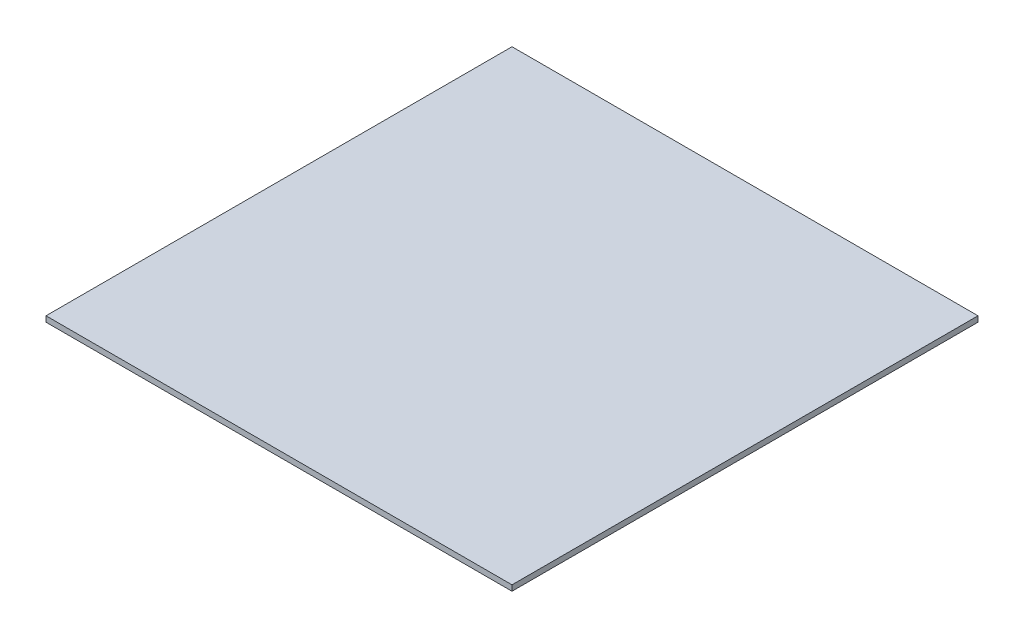
ISO-10303-21;
HEADER;
FILE_DESCRIPTION(('STEP AP214'),'2;1');
FILE_NAME('part.step','',(''),(''),'','','');
FILE_SCHEMA(('AUTOMOTIVE_DESIGN { 1 0 10303 214 1 1 1 1 }'));
ENDSEC;
DATA;
#1=APPLICATION_CONTEXT('core data for automotive mechanical design processes');
#2=APPLICATION_PROTOCOL_DEFINITION('international standard','automotive_design',2000,#1);
#3=PRODUCT_CONTEXT('',#1,'mechanical');
#4=PRODUCT('Part','Part','',(#3));
#5=PRODUCT_RELATED_PRODUCT_CATEGORY('part','',(#4));
#6=PRODUCT_DEFINITION_FORMATION('','',#4);
#7=PRODUCT_DEFINITION_CONTEXT('part definition',#1,'design');
#8=PRODUCT_DEFINITION('design','',#6,#7);
#9=PRODUCT_DEFINITION_SHAPE('','',#8);
#10=(LENGTH_UNIT() NAMED_UNIT(*) SI_UNIT(.MILLI.,.METRE.));
#11=(NAMED_UNIT(*) PLANE_ANGLE_UNIT() SI_UNIT($,.RADIAN.));
#12=(NAMED_UNIT(*) SI_UNIT($,.STERADIAN.) SOLID_ANGLE_UNIT());
#13=UNCERTAINTY_MEASURE_WITH_UNIT(LENGTH_MEASURE(1.E-05),#10,'distance_accuracy_value','');
#14=(GEOMETRIC_REPRESENTATION_CONTEXT(3) GLOBAL_UNCERTAINTY_ASSIGNED_CONTEXT((#13)) GLOBAL_UNIT_ASSIGNED_CONTEXT((#10,
#11,#12)) REPRESENTATION_CONTEXT('',''));
#15=CARTESIAN_POINT('',(0.,0.,0.));
#16=DIRECTION('',(0.,0.,1.));
#17=DIRECTION('',(1.,0.,0.));
#18=AXIS2_PLACEMENT_3D('',#15,#16,#17);
#19=CARTESIAN_POINT('',(125.,3.,-125.));
#20=DIRECTION('',(-1.,0.,0.));
#21=DIRECTION('',(0.,0.,1.));
#22=AXIS2_PLACEMENT_3D('',#19,#20,#21);
#23=PLANE('',#22);
#24=DIRECTION('',(0.,0.,-1.));
#25=VECTOR('',#24,1.);
#26=CARTESIAN_POINT('',(125.,0.,-125.));
#27=LINE('',#26,#25);
#28=CARTESIAN_POINT('',(125.,0.,125.));
#29=VERTEX_POINT('',#28);
#30=CARTESIAN_POINT('',(125.,0.,-125.));
#31=VERTEX_POINT('',#30);
#32=EDGE_CURVE('E96',#29,#31,#27,.T.);
#33=ORIENTED_EDGE('',*,*,#32,.T.);
#34=DIRECTION('',(0.,-1.,0.));
#35=VECTOR('',#34,1.);
#36=CARTESIAN_POINT('',(125.,3.,-125.));
#37=LINE('',#36,#35);
#38=CARTESIAN_POINT('',(125.,3.,-125.));
#39=VERTEX_POINT('',#38);
#40=EDGE_CURVE('E11',#39,#31,#37,.T.);
#41=ORIENTED_EDGE('',*,*,#40,.F.);
#42=DIRECTION('',(0.,0.,-1.));
#43=VECTOR('',#42,1.);
#44=CARTESIAN_POINT('',(125.,3.,-125.));
#45=LINE('',#44,#43);
#46=CARTESIAN_POINT('',(125.,3.,125.));
#47=VERTEX_POINT('',#46);
#48=EDGE_CURVE('E84',#47,#39,#45,.T.);
#49=ORIENTED_EDGE('',*,*,#48,.F.);
#50=DIRECTION('',(0.,-1.,0.));
#51=VECTOR('',#50,1.);
#52=CARTESIAN_POINT('',(125.,3.,125.));
#53=LINE('',#52,#51);
#54=EDGE_CURVE('E92',#47,#29,#53,.T.);
#55=ORIENTED_EDGE('',*,*,#54,.T.);
#56=EDGE_LOOP('',(#33,#41,#49,#55));
#57=FACE_BOUND('',#56,.T.);
#58=ADVANCED_FACE('F33',(#57),#23,.F.);
#59=CARTESIAN_POINT('',(-125.,3.,-125.));
#60=DIRECTION('',(0.,0.,1.));
#61=DIRECTION('',(1.,0.,0.));
#62=AXIS2_PLACEMENT_3D('',#59,#60,#61);
#63=PLANE('',#62);
#64=DIRECTION('',(-1.,0.,0.));
#65=VECTOR('',#64,1.);
#66=CARTESIAN_POINT('',(-125.,0.,-125.));
#67=LINE('',#66,#65);
#68=CARTESIAN_POINT('',(-125.,0.,-125.));
#69=VERTEX_POINT('',#68);
#70=EDGE_CURVE('E88',#31,#69,#67,.T.);
#71=ORIENTED_EDGE('',*,*,#70,.T.);
#72=DIRECTION('',(0.,-1.,0.));
#73=VECTOR('',#72,1.);
#74=CARTESIAN_POINT('',(-125.,3.,-125.));
#75=LINE('',#74,#73);
#76=CARTESIAN_POINT('',(-125.,3.,-125.));
#77=VERTEX_POINT('',#76);
#78=EDGE_CURVE('E41',#77,#69,#75,.T.);
#79=ORIENTED_EDGE('',*,*,#78,.F.);
#80=DIRECTION('',(-1.,0.,0.));
#81=VECTOR('',#80,1.);
#82=CARTESIAN_POINT('',(-125.,3.,-125.));
#83=LINE('',#82,#81);
#84=EDGE_CURVE('E79',#39,#77,#83,.T.);
#85=ORIENTED_EDGE('',*,*,#84,.F.);
#86=ORIENTED_EDGE('',*,*,#40,.T.);
#87=EDGE_LOOP('',(#71,#79,#85,#86));
#88=FACE_BOUND('',#87,.T.);
#89=ADVANCED_FACE('F87',(#88),#63,.F.);
#90=CARTESIAN_POINT('',(-125.,3.,-125.));
#91=DIRECTION('',(1.,0.,0.));
#92=DIRECTION('',(0.,0.,-1.));
#93=AXIS2_PLACEMENT_3D('',#90,#91,#92);
#94=PLANE('',#93);
#95=DIRECTION('',(0.,0.,1.));
#96=VECTOR('',#95,1.);
#97=CARTESIAN_POINT('',(-125.,0.,-125.));
#98=LINE('',#97,#96);
#99=CARTESIAN_POINT('',(-125.,0.,125.));
#100=VERTEX_POINT('',#99);
#101=EDGE_CURVE('E66',#69,#100,#98,.T.);
#102=ORIENTED_EDGE('',*,*,#101,.T.);
#103=DIRECTION('',(0.,-1.,0.));
#104=VECTOR('',#103,1.);
#105=CARTESIAN_POINT('',(-125.,3.,125.));
#106=LINE('',#105,#104);
#107=CARTESIAN_POINT('',(-125.,3.,125.));
#108=VERTEX_POINT('',#107);
#109=EDGE_CURVE('E89',#108,#100,#106,.T.);
#110=ORIENTED_EDGE('',*,*,#109,.F.);
#111=DIRECTION('',(0.,0.,1.));
#112=VECTOR('',#111,1.);
#113=CARTESIAN_POINT('',(-125.,3.,-125.));
#114=LINE('',#113,#112);
#115=EDGE_CURVE('E82',#77,#108,#114,.T.);
#116=ORIENTED_EDGE('',*,*,#115,.F.);
#117=ORIENTED_EDGE('',*,*,#78,.T.);
#118=EDGE_LOOP('',(#102,#110,#116,#117));
#119=FACE_BOUND('',#118,.T.);
#120=ADVANCED_FACE('F90',(#119),#94,.F.);
#121=CARTESIAN_POINT('',(-125.,3.,125.));
#122=DIRECTION('',(0.,0.,-1.));
#123=DIRECTION('',(-1.,0.,0.));
#124=AXIS2_PLACEMENT_3D('',#121,#122,#123);
#125=PLANE('',#124);
#126=DIRECTION('',(1.,0.,0.));
#127=VECTOR('',#126,1.);
#128=CARTESIAN_POINT('',(-125.,0.,125.));
#129=LINE('',#128,#127);
#130=EDGE_CURVE('E72',#100,#29,#129,.T.);
#131=ORIENTED_EDGE('',*,*,#130,.T.);
#132=ORIENTED_EDGE('',*,*,#54,.F.);
#133=DIRECTION('',(1.,0.,0.));
#134=VECTOR('',#133,1.);
#135=CARTESIAN_POINT('',(-125.,3.,125.));
#136=LINE('',#135,#134);
#137=EDGE_CURVE('E49',#108,#47,#136,.T.);
#138=ORIENTED_EDGE('',*,*,#137,.F.);
#139=ORIENTED_EDGE('',*,*,#109,.T.);
#140=EDGE_LOOP('',(#131,#132,#138,#139));
#141=FACE_BOUND('',#140,.T.);
#142=ADVANCED_FACE('F103',(#141),#125,.F.);
#143=CARTESIAN_POINT('',(0.,3.,0.));
#144=DIRECTION('',(0.,1.,0.));
#145=DIRECTION('',(0.,0.,1.));
#146=AXIS2_PLACEMENT_3D('',#143,#144,#145);
#147=PLANE('',#146);
#148=ORIENTED_EDGE('',*,*,#48,.T.);
#149=ORIENTED_EDGE('',*,*,#84,.T.);
#150=ORIENTED_EDGE('',*,*,#115,.T.);
#151=ORIENTED_EDGE('',*,*,#137,.T.);
#152=EDGE_LOOP('',(#148,#149,#150,#151));
#153=FACE_BOUND('',#152,.T.);
#154=ADVANCED_FACE('F80',(#153),#147,.T.);
#155=CARTESIAN_POINT('',(0.,0.,0.));
#156=DIRECTION('',(0.,1.,0.));
#157=DIRECTION('',(0.,0.,1.));
#158=AXIS2_PLACEMENT_3D('',#155,#156,#157);
#159=PLANE('',#158);
#160=ORIENTED_EDGE('',*,*,#32,.F.);
#161=ORIENTED_EDGE('',*,*,#130,.F.);
#162=ORIENTED_EDGE('',*,*,#101,.F.);
#163=ORIENTED_EDGE('',*,*,#70,.F.);
#164=EDGE_LOOP('',(#160,#161,#162,#163));
#165=FACE_BOUND('',#164,.T.);
#166=ADVANCED_FACE('F106',(#165),#159,.F.);
#167=CLOSED_SHELL('',(#58,#89,#120,#142,#154,#166));
#168=MANIFOLD_SOLID_BREP('B2',#167);
#169=ADVANCED_BREP_SHAPE_REPRESENTATION('',(#18,#168),#14);
#170=SHAPE_DEFINITION_REPRESENTATION(#9,#169);
ENDSEC;
END-ISO-10303-21;
